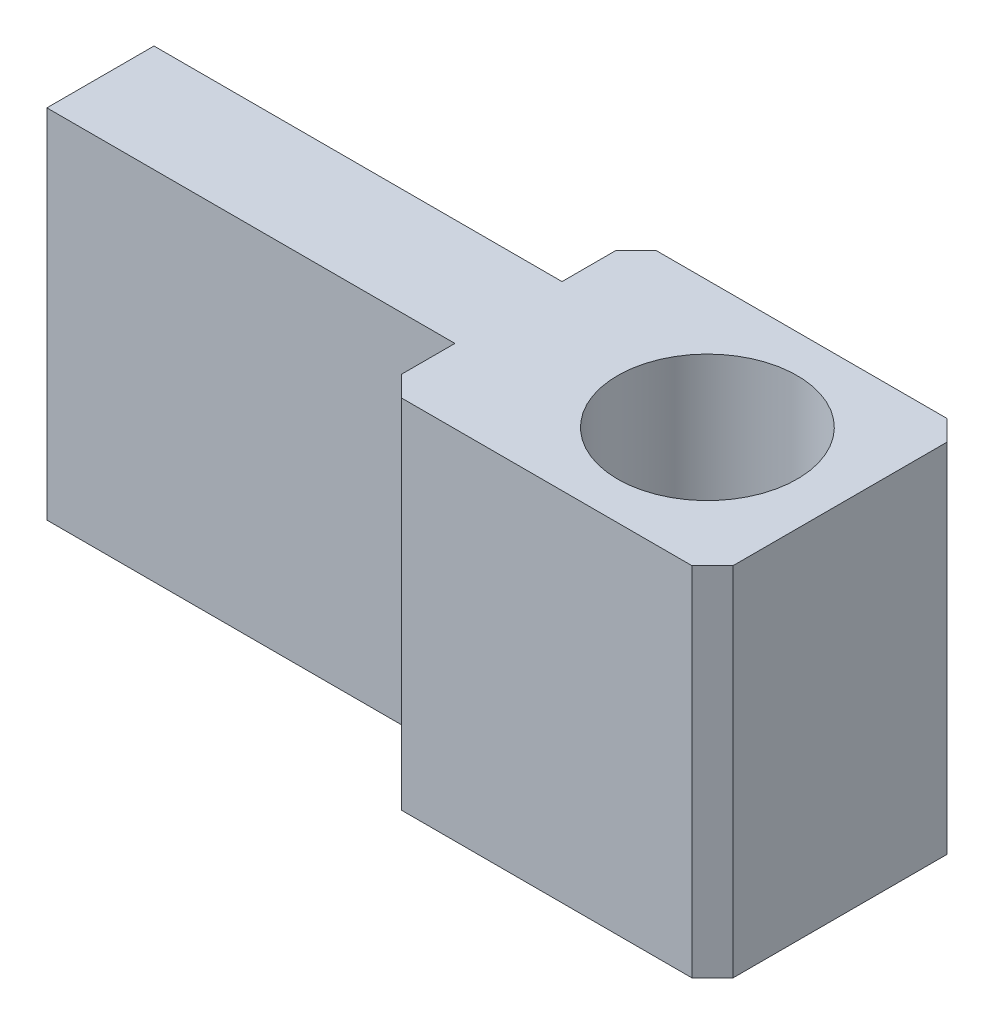
ISO-10303-21;
HEADER;
FILE_DESCRIPTION(('STEP AP214'),'2;1');
FILE_NAME('part.step','',(''),(''),'','','');
FILE_SCHEMA(('AUTOMOTIVE_DESIGN { 1 0 10303 214 1 1 1 1 }'));
ENDSEC;
DATA;
#1=APPLICATION_CONTEXT('core data for automotive mechanical design processes');
#2=APPLICATION_PROTOCOL_DEFINITION('international standard','automotive_design',2000,#1);
#3=PRODUCT_CONTEXT('',#1,'mechanical');
#4=PRODUCT('Part','Part','',(#3));
#5=PRODUCT_RELATED_PRODUCT_CATEGORY('part','',(#4));
#6=PRODUCT_DEFINITION_FORMATION('','',#4);
#7=PRODUCT_DEFINITION_CONTEXT('part definition',#1,'design');
#8=PRODUCT_DEFINITION('design','',#6,#7);
#9=PRODUCT_DEFINITION_SHAPE('','',#8);
#10=(LENGTH_UNIT() NAMED_UNIT(*) SI_UNIT(.MILLI.,.METRE.));
#11=(NAMED_UNIT(*) PLANE_ANGLE_UNIT() SI_UNIT($,.RADIAN.));
#12=(NAMED_UNIT(*) SI_UNIT($,.STERADIAN.) SOLID_ANGLE_UNIT());
#13=UNCERTAINTY_MEASURE_WITH_UNIT(LENGTH_MEASURE(1.E-05),#10,'distance_accuracy_value','');
#14=(GEOMETRIC_REPRESENTATION_CONTEXT(3) GLOBAL_UNCERTAINTY_ASSIGNED_CONTEXT((#13)) GLOBAL_UNIT_ASSIGNED_CONTEXT((#10,
#11,#12)) REPRESENTATION_CONTEXT('',''));
#15=CARTESIAN_POINT('',(0.,0.,0.));
#16=DIRECTION('',(0.,0.,1.));
#17=DIRECTION('',(1.,0.,0.));
#18=AXIS2_PLACEMENT_3D('',#15,#16,#17);
#19=CARTESIAN_POINT('',(0.,44.45,0.));
#20=DIRECTION('',(0.,0.,-1.));
#21=DIRECTION('',(-1.,0.,0.));
#22=AXIS2_PLACEMENT_3D('',#19,#20,#21);
#23=PLANE('',#22);
#24=DIRECTION('',(1.,0.,0.));
#25=VECTOR('',#24,1.);
#26=CARTESIAN_POINT('',(0.,0.,0.));
#27=LINE('',#26,#25);
#28=CARTESIAN_POINT('',(2.54,0.,0.));
#29=VERTEX_POINT('',#28);
#30=CARTESIAN_POINT('',(38.735,0.,0.));
#31=VERTEX_POINT('',#30);
#32=EDGE_CURVE('E165',#29,#31,#27,.T.);
#33=ORIENTED_EDGE('',*,*,#32,.T.);
#34=DIRECTION('',(0.,1.,0.));
#35=VECTOR('',#34,1.);
#36=CARTESIAN_POINT('',(38.735,44.45,0.));
#37=LINE('',#36,#35);
#38=CARTESIAN_POINT('',(38.735,44.45,0.));
#39=VERTEX_POINT('',#38);
#40=EDGE_CURVE('E199',#31,#39,#37,.T.);
#41=ORIENTED_EDGE('',*,*,#40,.T.);
#42=DIRECTION('',(1.,0.,0.));
#43=VECTOR('',#42,1.);
#44=CARTESIAN_POINT('',(0.,44.45,0.));
#45=LINE('',#44,#43);
#46=CARTESIAN_POINT('',(2.54,44.45,0.));
#47=VERTEX_POINT('',#46);
#48=EDGE_CURVE('E231',#47,#39,#45,.T.);
#49=ORIENTED_EDGE('',*,*,#48,.F.);
#50=DIRECTION('',(0.,-1.,0.));
#51=VECTOR('',#50,1.);
#52=CARTESIAN_POINT('',(2.54,0.,0.));
#53=LINE('',#52,#51);
#54=EDGE_CURVE('E196',#47,#29,#53,.T.);
#55=ORIENTED_EDGE('',*,*,#54,.T.);
#56=EDGE_LOOP('',(#33,#41,#49,#55));
#57=FACE_BOUND('',#56,.T.);
#58=ADVANCED_FACE('F36',(#57),#23,.F.);
#59=CARTESIAN_POINT('',(41.275,44.45,0.));
#60=DIRECTION('',(-1.,0.,0.));
#61=DIRECTION('',(0.,0.,1.));
#62=AXIS2_PLACEMENT_3D('',#59,#60,#61);
#63=PLANE('',#62);
#64=DIRECTION('',(0.,0.,-1.));
#65=VECTOR('',#64,1.);
#66=CARTESIAN_POINT('',(41.275,44.45,0.));
#67=LINE('',#66,#65);
#68=CARTESIAN_POINT('',(41.275,44.45,-2.54000000000001));
#69=VERTEX_POINT('',#68);
#70=CARTESIAN_POINT('',(41.275,44.45,-29.21));
#71=VERTEX_POINT('',#70);
#72=EDGE_CURVE('E149',#69,#71,#67,.T.);
#73=ORIENTED_EDGE('',*,*,#72,.F.);
#74=DIRECTION('',(0.,-1.,0.));
#75=VECTOR('',#74,1.);
#76=CARTESIAN_POINT('',(41.275,44.45,-2.54));
#77=LINE('',#76,#75);
#78=CARTESIAN_POINT('',(41.275,0.,-2.54));
#79=VERTEX_POINT('',#78);
#80=EDGE_CURVE('E187',#69,#79,#77,.T.);
#81=ORIENTED_EDGE('',*,*,#80,.T.);
#82=DIRECTION('',(0.,0.,-1.));
#83=VECTOR('',#82,1.);
#84=CARTESIAN_POINT('',(41.275,0.,0.));
#85=LINE('',#84,#83);
#86=CARTESIAN_POINT('',(41.275,0.,-29.21));
#87=VERTEX_POINT('',#86);
#88=EDGE_CURVE('E168',#79,#87,#85,.T.);
#89=ORIENTED_EDGE('',*,*,#88,.T.);
#90=DIRECTION('',(0.,1.,0.));
#91=VECTOR('',#90,1.);
#92=CARTESIAN_POINT('',(41.275,44.45,-29.21));
#93=LINE('',#92,#91);
#94=EDGE_CURVE('E133',#87,#71,#93,.T.);
#95=ORIENTED_EDGE('',*,*,#94,.T.);
#96=EDGE_LOOP('',(#73,#81,#89,#95));
#97=FACE_BOUND('',#96,.T.);
#98=ADVANCED_FACE('F240',(#97),#63,.F.);
#99=CARTESIAN_POINT('',(0.,44.45,-31.75));
#100=DIRECTION('',(0.,0.,-1.));
#101=DIRECTION('',(-1.,0.,0.));
#102=AXIS2_PLACEMENT_3D('',#99,#100,#101);
#103=PLANE('',#102);
#104=DIRECTION('',(1.,0.,0.));
#105=VECTOR('',#104,1.);
#106=CARTESIAN_POINT('',(0.,0.,-31.75));
#107=LINE('',#106,#105);
#108=CARTESIAN_POINT('',(2.54000000000001,0.,-31.75));
#109=VERTEX_POINT('',#108);
#110=CARTESIAN_POINT('',(38.735,0.,-31.75));
#111=VERTEX_POINT('',#110);
#112=EDGE_CURVE('E172',#109,#111,#107,.T.);
#113=ORIENTED_EDGE('',*,*,#112,.F.);
#114=DIRECTION('',(0.,1.,0.));
#115=VECTOR('',#114,1.);
#116=CARTESIAN_POINT('',(2.54000000000001,44.45,-31.75));
#117=LINE('',#116,#115);
#118=CARTESIAN_POINT('',(2.54000000000002,44.45,-31.75));
#119=VERTEX_POINT('',#118);
#120=EDGE_CURVE('E44',#109,#119,#117,.T.);
#121=ORIENTED_EDGE('',*,*,#120,.T.);
#122=DIRECTION('',(1.,0.,0.));
#123=VECTOR('',#122,1.);
#124=CARTESIAN_POINT('',(0.,44.45,-31.75));
#125=LINE('',#124,#123);
#126=CARTESIAN_POINT('',(38.735,44.45,-31.75));
#127=VERTEX_POINT('',#126);
#128=EDGE_CURVE('E146',#119,#127,#125,.T.);
#129=ORIENTED_EDGE('',*,*,#128,.T.);
#130=DIRECTION('',(0.,-1.,0.));
#131=VECTOR('',#130,1.);
#132=CARTESIAN_POINT('',(38.735,0.,-31.75));
#133=LINE('',#132,#131);
#134=EDGE_CURVE('E208',#127,#111,#133,.T.);
#135=ORIENTED_EDGE('',*,*,#134,.T.);
#136=EDGE_LOOP('',(#113,#121,#129,#135));
#137=FACE_BOUND('',#136,.T.);
#138=ADVANCED_FACE('F275',(#137),#103,.T.);
#139=CARTESIAN_POINT('',(0.,44.45,0.));
#140=DIRECTION('',(-1.,0.,0.));
#141=DIRECTION('',(0.,0.,1.));
#142=AXIS2_PLACEMENT_3D('',#139,#140,#141);
#143=PLANE('',#142);
#144=DIRECTION('',(0.,0.,-1.));
#145=VECTOR('',#144,1.);
#146=CARTESIAN_POINT('',(0.,44.45,0.));
#147=LINE('',#146,#145);
#148=CARTESIAN_POINT('',(0.,44.45,-22.5425));
#149=VERTEX_POINT('',#148);
#150=CARTESIAN_POINT('',(0.,44.45,-29.21));
#151=VERTEX_POINT('',#150);
#152=EDGE_CURVE('E128',#149,#151,#147,.T.);
#153=ORIENTED_EDGE('',*,*,#152,.T.);
#154=DIRECTION('',(0.,-1.,0.));
#155=VECTOR('',#154,1.);
#156=CARTESIAN_POINT('',(0.,44.45,-29.21));
#157=LINE('',#156,#155);
#158=CARTESIAN_POINT('',(0.,0.,-29.21));
#159=VERTEX_POINT('',#158);
#160=EDGE_CURVE('E213',#151,#159,#157,.T.);
#161=ORIENTED_EDGE('',*,*,#160,.T.);
#162=DIRECTION('',(0.,0.,-1.));
#163=VECTOR('',#162,1.);
#164=CARTESIAN_POINT('',(0.,0.,0.));
#165=LINE('',#164,#163);
#166=CARTESIAN_POINT('',(0.,0.,-22.5425));
#167=VERTEX_POINT('',#166);
#168=EDGE_CURVE('E130',#167,#159,#165,.T.);
#169=ORIENTED_EDGE('',*,*,#168,.F.);
#170=DIRECTION('',(0.,-1.,0.));
#171=VECTOR('',#170,1.);
#172=CARTESIAN_POINT('',(0.,44.45,-22.5425));
#173=LINE('',#172,#171);
#174=EDGE_CURVE('E123',#149,#167,#173,.T.);
#175=ORIENTED_EDGE('',*,*,#174,.F.);
#176=EDGE_LOOP('',(#153,#161,#169,#175));
#177=FACE_BOUND('',#176,.T.);
#178=ADVANCED_FACE('F125',(#177),#143,.T.);
#179=CARTESIAN_POINT('',(0.,44.45,-22.5425));
#180=DIRECTION('',(0.,0.,1.));
#181=DIRECTION('',(1.,0.,0.));
#182=AXIS2_PLACEMENT_3D('',#179,#180,#181);
#183=PLANE('',#182);
#184=DIRECTION('',(-1.,0.,0.));
#185=VECTOR('',#184,1.);
#186=CARTESIAN_POINT('',(0.,0.,-22.5425));
#187=LINE('',#186,#185);
#188=CARTESIAN_POINT('',(-50.8,0.,-22.5425));
#189=VERTEX_POINT('',#188);
#190=EDGE_CURVE('E175',#167,#189,#187,.T.);
#191=ORIENTED_EDGE('',*,*,#190,.T.);
#192=DIRECTION('',(0.,-1.,0.));
#193=VECTOR('',#192,1.);
#194=CARTESIAN_POINT('',(-50.8,44.45,-22.5425));
#195=LINE('',#194,#193);
#196=CARTESIAN_POINT('',(-50.8,44.45,-22.5425));
#197=VERTEX_POINT('',#196);
#198=EDGE_CURVE('E134',#197,#189,#195,.T.);
#199=ORIENTED_EDGE('',*,*,#198,.F.);
#200=DIRECTION('',(-1.,0.,0.));
#201=VECTOR('',#200,1.);
#202=CARTESIAN_POINT('',(0.,44.45,-22.5425));
#203=LINE('',#202,#201);
#204=EDGE_CURVE('E137',#149,#197,#203,.T.);
#205=ORIENTED_EDGE('',*,*,#204,.F.);
#206=ORIENTED_EDGE('',*,*,#174,.T.);
#207=EDGE_LOOP('',(#191,#199,#205,#206));
#208=FACE_BOUND('',#207,.T.);
#209=ADVANCED_FACE('F138',(#208),#183,.F.);
#210=CARTESIAN_POINT('',(-50.8,44.45,0.));
#211=DIRECTION('',(1.,0.,0.));
#212=DIRECTION('',(0.,0.,-1.));
#213=AXIS2_PLACEMENT_3D('',#210,#211,#212);
#214=PLANE('',#213);
#215=DIRECTION('',(0.,0.,1.));
#216=VECTOR('',#215,1.);
#217=CARTESIAN_POINT('',(-50.8,0.,0.));
#218=LINE('',#217,#216);
#219=CARTESIAN_POINT('',(-50.8,0.,-9.2075));
#220=VERTEX_POINT('',#219);
#221=EDGE_CURVE('E178',#189,#220,#218,.T.);
#222=ORIENTED_EDGE('',*,*,#221,.T.);
#223=DIRECTION('',(0.,-1.,0.));
#224=VECTOR('',#223,1.);
#225=CARTESIAN_POINT('',(-50.8,44.45,-9.2075));
#226=LINE('',#225,#224);
#227=CARTESIAN_POINT('',(-50.8,44.45,-9.2075));
#228=VERTEX_POINT('',#227);
#229=EDGE_CURVE('E157',#228,#220,#226,.T.);
#230=ORIENTED_EDGE('',*,*,#229,.F.);
#231=DIRECTION('',(0.,0.,1.));
#232=VECTOR('',#231,1.);
#233=CARTESIAN_POINT('',(-50.8,44.45,0.));
#234=LINE('',#233,#232);
#235=EDGE_CURVE('E142',#197,#228,#234,.T.);
#236=ORIENTED_EDGE('',*,*,#235,.F.);
#237=ORIENTED_EDGE('',*,*,#198,.T.);
#238=EDGE_LOOP('',(#222,#230,#236,#237));
#239=FACE_BOUND('',#238,.T.);
#240=ADVANCED_FACE('F219',(#239),#214,.F.);
#241=CARTESIAN_POINT('',(0.,44.45,-9.2075));
#242=DIRECTION('',(0.,0.,1.));
#243=DIRECTION('',(1.,0.,0.));
#244=AXIS2_PLACEMENT_3D('',#241,#242,#243);
#245=PLANE('',#244);
#246=DIRECTION('',(-1.,0.,0.));
#247=VECTOR('',#246,1.);
#248=CARTESIAN_POINT('',(0.,0.,-9.2075));
#249=LINE('',#248,#247);
#250=CARTESIAN_POINT('',(0.,0.,-9.2075));
#251=VERTEX_POINT('',#250);
#252=EDGE_CURVE('E181',#251,#220,#249,.T.);
#253=ORIENTED_EDGE('',*,*,#252,.F.);
#254=DIRECTION('',(0.,-1.,0.));
#255=VECTOR('',#254,1.);
#256=CARTESIAN_POINT('',(0.,44.45,-9.2075));
#257=LINE('',#256,#255);
#258=CARTESIAN_POINT('',(0.,44.45,-9.2075));
#259=VERTEX_POINT('',#258);
#260=EDGE_CURVE('E151',#259,#251,#257,.T.);
#261=ORIENTED_EDGE('',*,*,#260,.F.);
#262=DIRECTION('',(-1.,0.,0.));
#263=VECTOR('',#262,1.);
#264=CARTESIAN_POINT('',(0.,44.45,-9.2075));
#265=LINE('',#264,#263);
#266=EDGE_CURVE('E152',#259,#228,#265,.T.);
#267=ORIENTED_EDGE('',*,*,#266,.T.);
#268=ORIENTED_EDGE('',*,*,#229,.T.);
#269=EDGE_LOOP('',(#253,#261,#267,#268));
#270=FACE_BOUND('',#269,.T.);
#271=ADVANCED_FACE('F268',(#270),#245,.T.);
#272=CARTESIAN_POINT('',(0.,0.,-2.54000000000001));
#273=VERTEX_POINT('',#272);
#274=EDGE_CURVE('E176',#273,#251,#165,.T.);
#275=ORIENTED_EDGE('',*,*,#274,.F.);
#276=DIRECTION('',(0.,1.,0.));
#277=VECTOR('',#276,1.);
#278=CARTESIAN_POINT('',(0.,44.45,-2.54000000000001));
#279=LINE('',#278,#277);
#280=CARTESIAN_POINT('',(0.,44.45,-2.54000000000001));
#281=VERTEX_POINT('',#280);
#282=EDGE_CURVE('E211',#273,#281,#279,.T.);
#283=ORIENTED_EDGE('',*,*,#282,.T.);
#284=EDGE_CURVE('E148',#281,#259,#147,.T.);
#285=ORIENTED_EDGE('',*,*,#284,.T.);
#286=ORIENTED_EDGE('',*,*,#260,.T.);
#287=EDGE_LOOP('',(#275,#283,#285,#286));
#288=FACE_BOUND('',#287,.T.);
#289=ADVANCED_FACE('F261',(#288),#143,.T.);
#290=CARTESIAN_POINT('',(0.,44.45,0.));
#291=DIRECTION('',(0.,1.,0.));
#292=DIRECTION('',(0.,0.,1.));
#293=AXIS2_PLACEMENT_3D('',#290,#291,#292);
#294=PLANE('',#293);
#295=CARTESIAN_POINT('',(24.765,44.45,-15.875));
#296=DIRECTION('',(0.,1.,0.));
#297=DIRECTION('',(0.,0.,1.));
#298=AXIS2_PLACEMENT_3D('',#295,#296,#297);
#299=CIRCLE('',#298,11.176);
#300=CARTESIAN_POINT('',(24.765,44.45,-4.699));
#301=VERTEX_POINT('',#300);
#302=EDGE_CURVE('E247',#301,#301,#299,.T.);
#303=ORIENTED_EDGE('',*,*,#302,.F.);
#304=EDGE_LOOP('',(#303));
#305=FACE_BOUND('',#304,.T.);
#306=ORIENTED_EDGE('',*,*,#128,.F.);
#307=DIRECTION('',(0.70710678118655,0.,-0.707106781186546));
#308=VECTOR('',#307,1.);
#309=CARTESIAN_POINT('',(-14.605,44.45,-14.6050000000001));
#310=LINE('',#309,#308);
#311=EDGE_CURVE('E11',#119,#151,#310,.F.);
#312=ORIENTED_EDGE('',*,*,#311,.T.);
#313=ORIENTED_EDGE('',*,*,#152,.F.);
#314=ORIENTED_EDGE('',*,*,#204,.T.);
#315=ORIENTED_EDGE('',*,*,#235,.T.);
#316=ORIENTED_EDGE('',*,*,#266,.F.);
#317=ORIENTED_EDGE('',*,*,#284,.F.);
#318=DIRECTION('',(0.707106781186546,0.,0.70710678118655));
#319=VECTOR('',#318,1.);
#320=CARTESIAN_POINT('',(1.27000000000001,44.45,-1.27));
#321=LINE('',#320,#319);
#322=EDGE_CURVE('E201',#281,#47,#321,.T.);
#323=ORIENTED_EDGE('',*,*,#322,.T.);
#324=ORIENTED_EDGE('',*,*,#48,.T.);
#325=DIRECTION('',(-0.70710678118655,0.,0.707106781186546));
#326=VECTOR('',#325,1.);
#327=CARTESIAN_POINT('',(19.3674999999999,44.45,19.3675));
#328=LINE('',#327,#326);
#329=EDGE_CURVE('E206',#39,#69,#328,.F.);
#330=ORIENTED_EDGE('',*,*,#329,.T.);
#331=ORIENTED_EDGE('',*,*,#72,.T.);
#332=DIRECTION('',(-0.707106781186548,0.,-0.707106781186548));
#333=VECTOR('',#332,1.);
#334=CARTESIAN_POINT('',(35.2425,44.45,-35.2425));
#335=LINE('',#334,#333);
#336=EDGE_CURVE('E203',#71,#127,#335,.T.);
#337=ORIENTED_EDGE('',*,*,#336,.T.);
#338=EDGE_LOOP('',(#306,#312,#313,#314,#315,#316,#317,#323,#324,#330,#331,#337));
#339=FACE_BOUND('',#338,.T.);
#340=ADVANCED_FACE('F144',(#305,#339),#294,.T.);
#341=CARTESIAN_POINT('',(0.,0.,0.));
#342=DIRECTION('',(0.,1.,0.));
#343=DIRECTION('',(0.,0.,1.));
#344=AXIS2_PLACEMENT_3D('',#341,#342,#343);
#345=PLANE('',#344);
#346=CARTESIAN_POINT('',(24.765,0.,-15.875));
#347=DIRECTION('',(0.,1.,0.));
#348=DIRECTION('',(0.,0.,1.));
#349=AXIS2_PLACEMENT_3D('',#346,#347,#348);
#350=CIRCLE('',#349,11.176);
#351=CARTESIAN_POINT('',(24.765,0.,-4.699));
#352=VERTEX_POINT('',#351);
#353=EDGE_CURVE('E169',#352,#352,#350,.T.);
#354=ORIENTED_EDGE('',*,*,#353,.T.);
#355=EDGE_LOOP('',(#354));
#356=FACE_BOUND('',#355,.T.);
#357=ORIENTED_EDGE('',*,*,#168,.T.);
#358=DIRECTION('',(-0.70710678118655,0.,0.707106781186546));
#359=VECTOR('',#358,1.);
#360=CARTESIAN_POINT('',(0.,0.,-29.21));
#361=LINE('',#360,#359);
#362=EDGE_CURVE('E58',#159,#109,#361,.F.);
#363=ORIENTED_EDGE('',*,*,#362,.T.);
#364=ORIENTED_EDGE('',*,*,#112,.T.);
#365=DIRECTION('',(0.707106781186548,0.,0.707106781186548));
#366=VECTOR('',#365,1.);
#367=CARTESIAN_POINT('',(38.735,0.,-31.75));
#368=LINE('',#367,#366);
#369=EDGE_CURVE('E192',#111,#87,#368,.T.);
#370=ORIENTED_EDGE('',*,*,#369,.T.);
#371=ORIENTED_EDGE('',*,*,#88,.F.);
#372=DIRECTION('',(0.70710678118655,0.,-0.707106781186546));
#373=VECTOR('',#372,1.);
#374=CARTESIAN_POINT('',(41.275,0.,-2.54));
#375=LINE('',#374,#373);
#376=EDGE_CURVE('E194',#79,#31,#375,.F.);
#377=ORIENTED_EDGE('',*,*,#376,.T.);
#378=ORIENTED_EDGE('',*,*,#32,.F.);
#379=DIRECTION('',(-0.707106781186546,0.,-0.70710678118655));
#380=VECTOR('',#379,1.);
#381=CARTESIAN_POINT('',(2.54,0.,0.));
#382=LINE('',#381,#380);
#383=EDGE_CURVE('E190',#29,#273,#382,.T.);
#384=ORIENTED_EDGE('',*,*,#383,.T.);
#385=ORIENTED_EDGE('',*,*,#274,.T.);
#386=ORIENTED_EDGE('',*,*,#252,.T.);
#387=ORIENTED_EDGE('',*,*,#221,.F.);
#388=ORIENTED_EDGE('',*,*,#190,.F.);
#389=EDGE_LOOP('',(#357,#363,#364,#370,#371,#377,#378,#384,#385,#386,#387,#388));
#390=FACE_BOUND('',#389,.T.);
#391=ADVANCED_FACE('F216',(#356,#390),#345,.F.);
#392=CARTESIAN_POINT('',(41.275,44.45,-2.54));
#393=DIRECTION('',(-0.707106781186546,0.,-0.70710678118655));
#394=DIRECTION('',(0.,-1.,0.));
#395=AXIS2_PLACEMENT_3D('',#392,#393,#394);
#396=PLANE('',#395);
#397=ORIENTED_EDGE('',*,*,#329,.F.);
#398=ORIENTED_EDGE('',*,*,#40,.F.);
#399=ORIENTED_EDGE('',*,*,#376,.F.);
#400=ORIENTED_EDGE('',*,*,#80,.F.);
#401=EDGE_LOOP('',(#397,#398,#399,#400));
#402=FACE_BOUND('',#401,.T.);
#403=ADVANCED_FACE('F237',(#402),#396,.F.);
#404=CARTESIAN_POINT('',(38.735,44.45,-31.75));
#405=DIRECTION('',(0.707106781186548,0.,-0.707106781186548));
#406=DIRECTION('',(0.,1.,0.));
#407=AXIS2_PLACEMENT_3D('',#404,#405,#406);
#408=PLANE('',#407);
#409=ORIENTED_EDGE('',*,*,#336,.F.);
#410=ORIENTED_EDGE('',*,*,#94,.F.);
#411=ORIENTED_EDGE('',*,*,#369,.F.);
#412=ORIENTED_EDGE('',*,*,#134,.F.);
#413=EDGE_LOOP('',(#409,#410,#411,#412));
#414=FACE_BOUND('',#413,.T.);
#415=ADVANCED_FACE('F281',(#414),#408,.T.);
#416=CARTESIAN_POINT('',(2.54,44.45,0.));
#417=DIRECTION('',(-0.70710678118655,0.,0.707106781186546));
#418=DIRECTION('',(0.,1.,0.));
#419=AXIS2_PLACEMENT_3D('',#416,#417,#418);
#420=PLANE('',#419);
#421=ORIENTED_EDGE('',*,*,#322,.F.);
#422=ORIENTED_EDGE('',*,*,#282,.F.);
#423=ORIENTED_EDGE('',*,*,#383,.F.);
#424=ORIENTED_EDGE('',*,*,#54,.F.);
#425=EDGE_LOOP('',(#421,#422,#423,#424));
#426=FACE_BOUND('',#425,.T.);
#427=ADVANCED_FACE('F227',(#426),#420,.T.);
#428=CARTESIAN_POINT('',(0.,44.45,-29.21));
#429=DIRECTION('',(0.707106781186546,0.,0.70710678118655));
#430=DIRECTION('',(0.,-1.,0.));
#431=AXIS2_PLACEMENT_3D('',#428,#429,#430);
#432=PLANE('',#431);
#433=ORIENTED_EDGE('',*,*,#311,.F.);
#434=ORIENTED_EDGE('',*,*,#120,.F.);
#435=ORIENTED_EDGE('',*,*,#362,.F.);
#436=ORIENTED_EDGE('',*,*,#160,.F.);
#437=EDGE_LOOP('',(#433,#434,#435,#436));
#438=FACE_BOUND('',#437,.T.);
#439=ADVANCED_FACE('F38',(#438),#432,.F.);
#440=CARTESIAN_POINT('',(24.765,0.,-15.875));
#441=DIRECTION('',(0.,1.,0.));
#442=DIRECTION('',(0.,0.,1.));
#443=AXIS2_PLACEMENT_3D('',#440,#441,#442);
#444=CYLINDRICAL_SURFACE('',#443,11.176);
#445=ORIENTED_EDGE('',*,*,#353,.F.);
#446=EDGE_LOOP('',(#445));
#447=FACE_BOUND('',#446,.T.);
#448=ORIENTED_EDGE('',*,*,#302,.T.);
#449=EDGE_LOOP('',(#448));
#450=FACE_BOUND('',#449,.T.);
#451=ADVANCED_FACE('F254',(#447,#450),#444,.F.);
#452=CLOSED_SHELL('',(#58,#98,#138,#178,#209,#240,#271,#289,#340,#391,#403,#415,#427,#439,#451));
#453=MANIFOLD_SOLID_BREP('B2',#452);
#454=ADVANCED_BREP_SHAPE_REPRESENTATION('',(#18,#453),#14);
#455=SHAPE_DEFINITION_REPRESENTATION(#9,#454);
ENDSEC;
END-ISO-10303-21;
